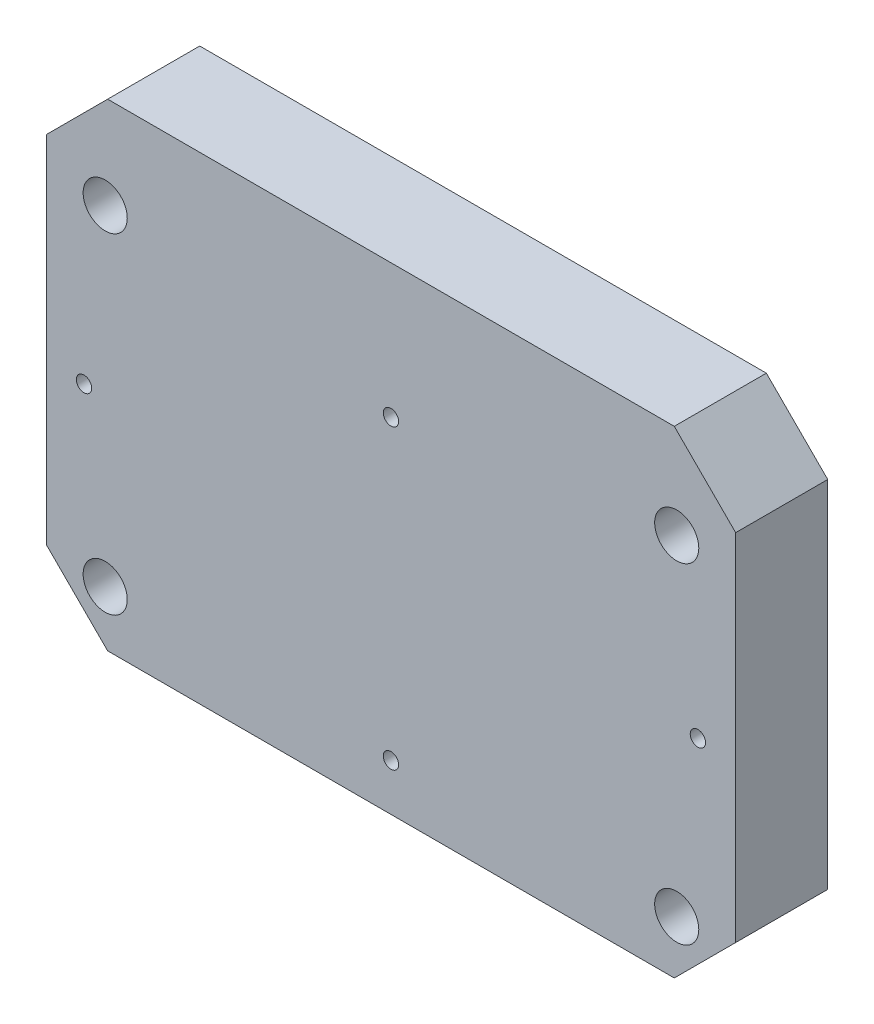
ISO-10303-21;
HEADER;
FILE_DESCRIPTION(('STEP AP214'),'2;1');
FILE_NAME('part.step','',(''),(''),'','','');
FILE_SCHEMA(('AUTOMOTIVE_DESIGN { 1 0 10303 214 1 1 1 1 }'));
ENDSEC;
DATA;
#1=APPLICATION_CONTEXT('core data for automotive mechanical design processes');
#2=APPLICATION_PROTOCOL_DEFINITION('international standard','automotive_design',2000,#1);
#3=PRODUCT_CONTEXT('',#1,'mechanical');
#4=PRODUCT('Part','Part','',(#3));
#5=PRODUCT_RELATED_PRODUCT_CATEGORY('part','',(#4));
#6=PRODUCT_DEFINITION_FORMATION('','',#4);
#7=PRODUCT_DEFINITION_CONTEXT('part definition',#1,'design');
#8=PRODUCT_DEFINITION('design','',#6,#7);
#9=PRODUCT_DEFINITION_SHAPE('','',#8);
#10=(LENGTH_UNIT() NAMED_UNIT(*) SI_UNIT(.MILLI.,.METRE.));
#11=(NAMED_UNIT(*) PLANE_ANGLE_UNIT() SI_UNIT($,.RADIAN.));
#12=(NAMED_UNIT(*) SI_UNIT($,.STERADIAN.) SOLID_ANGLE_UNIT());
#13=UNCERTAINTY_MEASURE_WITH_UNIT(LENGTH_MEASURE(1.E-05),#10,'distance_accuracy_value','');
#14=(GEOMETRIC_REPRESENTATION_CONTEXT(3) GLOBAL_UNCERTAINTY_ASSIGNED_CONTEXT((#13)) GLOBAL_UNIT_ASSIGNED_CONTEXT((#10,
#11,#12)) REPRESENTATION_CONTEXT('',''));
#15=CARTESIAN_POINT('',(0.,0.,0.));
#16=DIRECTION('',(0.,0.,1.));
#17=DIRECTION('',(1.,0.,0.));
#18=AXIS2_PLACEMENT_3D('',#15,#16,#17);
#19=CARTESIAN_POINT('',(71.3144877519594,489.236052622076,19.05));
#20=DIRECTION('',(-1.,0.,0.));
#21=DIRECTION('',(0.,-1.,0.));
#22=AXIS2_PLACEMENT_3D('',#19,#20,#21);
#23=PLANE('',#22);
#24=DIRECTION('',(0.,1.,0.));
#25=VECTOR('',#24,1.);
#26=CARTESIAN_POINT('',(71.3144877519594,489.236052622076,19.05));
#27=LINE('',#26,#25);
#28=CARTESIAN_POINT('',(71.3144877519594,403.092401694058,19.05));
#29=VERTEX_POINT('',#28);
#30=CARTESIAN_POINT('',(71.3144877519594,476.536052622076,19.05));
#31=VERTEX_POINT('',#30);
#32=EDGE_CURVE('E134',#29,#31,#27,.T.);
#33=ORIENTED_EDGE('',*,*,#32,.F.);
#34=DIRECTION('',(0.,0.,-1.));
#35=VECTOR('',#34,1.);
#36=CARTESIAN_POINT('',(71.3144877519594,403.092401694058,19.05));
#37=LINE('',#36,#35);
#38=CARTESIAN_POINT('',(71.3144877519594,403.092401694058,0.));
#39=VERTEX_POINT('',#38);
#40=EDGE_CURVE('E11',#29,#39,#37,.T.);
#41=ORIENTED_EDGE('',*,*,#40,.T.);
#42=DIRECTION('',(0.,1.,0.));
#43=VECTOR('',#42,1.);
#44=CARTESIAN_POINT('',(71.3144877519594,489.236052622076,0.));
#45=LINE('',#44,#43);
#46=CARTESIAN_POINT('',(71.3144877519594,476.536052622076,0.));
#47=VERTEX_POINT('',#46);
#48=EDGE_CURVE('E210',#39,#47,#45,.T.);
#49=ORIENTED_EDGE('',*,*,#48,.T.);
#50=DIRECTION('',(0.,0.,1.));
#51=VECTOR('',#50,1.);
#52=CARTESIAN_POINT('',(71.3144877519594,476.536052622076,19.05));
#53=LINE('',#52,#51);
#54=EDGE_CURVE('E47',#47,#31,#53,.T.);
#55=ORIENTED_EDGE('',*,*,#54,.T.);
#56=EDGE_LOOP('',(#33,#41,#49,#55));
#57=FACE_BOUND('',#56,.T.);
#58=ADVANCED_FACE('F37',(#57),#23,.F.);
#59=CARTESIAN_POINT('',(71.3144877519594,489.236052622076,19.05));
#60=DIRECTION('',(0.,-1.,0.));
#61=DIRECTION('',(0.,0.,-1.));
#62=AXIS2_PLACEMENT_3D('',#59,#60,#61);
#63=PLANE('',#62);
#64=DIRECTION('',(-1.,0.,0.));
#65=VECTOR('',#64,1.);
#66=CARTESIAN_POINT('',(71.3144877519594,489.236052622076,0.));
#67=LINE('',#66,#65);
#68=CARTESIAN_POINT('',(58.6144877519594,489.236052622076,0.));
#69=VERTEX_POINT('',#68);
#70=CARTESIAN_POINT('',(-58.6144877521835,489.236052622076,0.));
#71=VERTEX_POINT('',#70);
#72=EDGE_CURVE('E139',#69,#71,#67,.T.);
#73=ORIENTED_EDGE('',*,*,#72,.T.);
#74=DIRECTION('',(0.,0.,1.));
#75=VECTOR('',#74,1.);
#76=CARTESIAN_POINT('',(-58.6144877521835,489.236052622076,19.05));
#77=LINE('',#76,#75);
#78=CARTESIAN_POINT('',(-58.6144877521835,489.236052622076,19.05));
#79=VERTEX_POINT('',#78);
#80=EDGE_CURVE('E55',#71,#79,#77,.T.);
#81=ORIENTED_EDGE('',*,*,#80,.T.);
#82=DIRECTION('',(-1.,0.,0.));
#83=VECTOR('',#82,1.);
#84=CARTESIAN_POINT('',(71.3144877519594,489.236052622076,19.05));
#85=LINE('',#84,#83);
#86=CARTESIAN_POINT('',(58.6144877519594,489.236052622076,19.05));
#87=VERTEX_POINT('',#86);
#88=EDGE_CURVE('E137',#87,#79,#85,.T.);
#89=ORIENTED_EDGE('',*,*,#88,.F.);
#90=DIRECTION('',(0.,0.,-1.));
#91=VECTOR('',#90,1.);
#92=CARTESIAN_POINT('',(58.6144877519594,489.236052622076,19.05));
#93=LINE('',#92,#91);
#94=EDGE_CURVE('E157',#87,#69,#93,.T.);
#95=ORIENTED_EDGE('',*,*,#94,.T.);
#96=EDGE_LOOP('',(#73,#81,#89,#95));
#97=FACE_BOUND('',#96,.T.);
#98=ADVANCED_FACE('F219',(#97),#63,.F.);
#99=CARTESIAN_POINT('',(-71.3144877521836,489.236052622076,19.05));
#100=DIRECTION('',(1.,0.,0.));
#101=DIRECTION('',(0.,0.,-1.));
#102=AXIS2_PLACEMENT_3D('',#99,#100,#101);
#103=PLANE('',#102);
#104=DIRECTION('',(0.,-1.,0.));
#105=VECTOR('',#104,1.);
#106=CARTESIAN_POINT('',(-71.3144877521836,489.236052622076,0.));
#107=LINE('',#106,#105);
#108=CARTESIAN_POINT('',(-71.3144877521836,476.536052622076,0.));
#109=VERTEX_POINT('',#108);
#110=CARTESIAN_POINT('',(-71.3144877521836,403.092401694058,0.));
#111=VERTEX_POINT('',#110);
#112=EDGE_CURVE('E135',#109,#111,#107,.T.);
#113=ORIENTED_EDGE('',*,*,#112,.T.);
#114=DIRECTION('',(0.,0.,1.));
#115=VECTOR('',#114,1.);
#116=CARTESIAN_POINT('',(-71.3144877521836,403.092401694058,19.05));
#117=LINE('',#116,#115);
#118=CARTESIAN_POINT('',(-71.3144877521836,403.092401694058,19.05));
#119=VERTEX_POINT('',#118);
#120=EDGE_CURVE('E112',#111,#119,#117,.T.);
#121=ORIENTED_EDGE('',*,*,#120,.T.);
#122=DIRECTION('',(0.,-1.,0.));
#123=VECTOR('',#122,1.);
#124=CARTESIAN_POINT('',(-71.3144877521836,489.236052622076,19.05));
#125=LINE('',#124,#123);
#126=CARTESIAN_POINT('',(-71.3144877521836,476.536052622076,19.05));
#127=VERTEX_POINT('',#126);
#128=EDGE_CURVE('E213',#127,#119,#125,.T.);
#129=ORIENTED_EDGE('',*,*,#128,.F.);
#130=DIRECTION('',(0.,0.,-1.));
#131=VECTOR('',#130,1.);
#132=CARTESIAN_POINT('',(-71.3144877521836,476.536052622076,19.05));
#133=LINE('',#132,#131);
#134=EDGE_CURVE('E117',#127,#109,#133,.T.);
#135=ORIENTED_EDGE('',*,*,#134,.T.);
#136=EDGE_LOOP('',(#113,#121,#129,#135));
#137=FACE_BOUND('',#136,.T.);
#138=ADVANCED_FACE('F228',(#137),#103,.F.);
#139=CARTESIAN_POINT('',(71.3144877519594,390.392401694058,19.05));
#140=DIRECTION('',(0.,1.,0.));
#141=DIRECTION('',(0.,0.,1.));
#142=AXIS2_PLACEMENT_3D('',#139,#140,#141);
#143=PLANE('',#142);
#144=DIRECTION('',(1.,0.,0.));
#145=VECTOR('',#144,1.);
#146=CARTESIAN_POINT('',(71.3144877519594,390.392401694058,19.05));
#147=LINE('',#146,#145);
#148=CARTESIAN_POINT('',(-58.6144877521835,390.392401694058,19.05));
#149=VERTEX_POINT('',#148);
#150=CARTESIAN_POINT('',(58.6144877519594,390.392401694058,19.05));
#151=VERTEX_POINT('',#150);
#152=EDGE_CURVE('E127',#149,#151,#147,.T.);
#153=ORIENTED_EDGE('',*,*,#152,.F.);
#154=DIRECTION('',(0.,0.,-1.));
#155=VECTOR('',#154,1.);
#156=CARTESIAN_POINT('',(-58.6144877521835,390.392401694058,19.05));
#157=LINE('',#156,#155);
#158=CARTESIAN_POINT('',(-58.6144877521835,390.392401694058,0.));
#159=VERTEX_POINT('',#158);
#160=EDGE_CURVE('E111',#149,#159,#157,.T.);
#161=ORIENTED_EDGE('',*,*,#160,.T.);
#162=DIRECTION('',(1.,0.,0.));
#163=VECTOR('',#162,1.);
#164=CARTESIAN_POINT('',(71.3144877519594,390.392401694058,0.));
#165=LINE('',#164,#163);
#166=CARTESIAN_POINT('',(58.6144877519594,390.392401694058,0.));
#167=VERTEX_POINT('',#166);
#168=EDGE_CURVE('E124',#159,#167,#165,.T.);
#169=ORIENTED_EDGE('',*,*,#168,.T.);
#170=DIRECTION('',(0.,0.,1.));
#171=VECTOR('',#170,1.);
#172=CARTESIAN_POINT('',(58.6144877519594,390.392401694058,19.05));
#173=LINE('',#172,#171);
#174=EDGE_CURVE('E129',#167,#151,#173,.T.);
#175=ORIENTED_EDGE('',*,*,#174,.T.);
#176=EDGE_LOOP('',(#153,#161,#169,#175));
#177=FACE_BOUND('',#176,.T.);
#178=ADVANCED_FACE('F123',(#177),#143,.F.);
#179=CARTESIAN_POINT('',(0.,0.,19.05));
#180=DIRECTION('',(0.,0.,-1.));
#181=DIRECTION('',(-1.,0.,0.));
#182=AXIS2_PLACEMENT_3D('',#179,#180,#181);
#183=PLANE('',#182);
#184=CARTESIAN_POINT('',(63.500000000001,435.779526687774,19.05));
#185=DIRECTION('',(0.,0.,-1.));
#186=DIRECTION('',(-1.,0.,0.));
#187=AXIS2_PLACEMENT_3D('',#184,#185,#186);
#188=CIRCLE('',#187,1.58750000000001);
#189=CARTESIAN_POINT('',(61.912500000001,435.779526687774,19.05));
#190=VERTEX_POINT('',#189);
#191=EDGE_CURVE('E42',#190,#190,#188,.T.);
#192=ORIENTED_EDGE('',*,*,#191,.T.);
#193=EDGE_LOOP('',(#192));
#194=FACE_BOUND('',#193,.T.);
#195=CARTESIAN_POINT('',(0.,461.558384256229,19.05));
#196=DIRECTION('',(0.,0.,-1.));
#197=DIRECTION('',(-1.,0.,0.));
#198=AXIS2_PLACEMENT_3D('',#195,#196,#197);
#199=CIRCLE('',#198,1.58750000000001);
#200=CARTESIAN_POINT('',(-1.58750000000001,461.558384256229,19.05));
#201=VERTEX_POINT('',#200);
#202=EDGE_CURVE('E169',#201,#201,#199,.T.);
#203=ORIENTED_EDGE('',*,*,#202,.T.);
#204=EDGE_LOOP('',(#203));
#205=FACE_BOUND('',#204,.T.);
#206=CARTESIAN_POINT('',(0.,400.075074406295,19.05));
#207=DIRECTION('',(0.,0.,-1.));
#208=DIRECTION('',(-1.,0.,0.));
#209=AXIS2_PLACEMENT_3D('',#206,#207,#208);
#210=CIRCLE('',#209,1.58750000000001);
#211=CARTESIAN_POINT('',(-1.58750000000001,400.075074406295,19.05));
#212=VERTEX_POINT('',#211);
#213=EDGE_CURVE('E167',#212,#212,#210,.T.);
#214=ORIENTED_EDGE('',*,*,#213,.T.);
#215=EDGE_LOOP('',(#214));
#216=FACE_BOUND('',#215,.T.);
#217=CARTESIAN_POINT('',(-63.500000000001,435.779526687774,19.05));
#218=DIRECTION('',(0.,0.,-1.));
#219=DIRECTION('',(-1.,0.,0.));
#220=AXIS2_PLACEMENT_3D('',#217,#218,#219);
#221=CIRCLE('',#220,1.58750000000001);
#222=CARTESIAN_POINT('',(-65.087500000001,435.779526687774,19.05));
#223=VERTEX_POINT('',#222);
#224=EDGE_CURVE('E165',#223,#223,#221,.T.);
#225=ORIENTED_EDGE('',*,*,#224,.T.);
#226=EDGE_LOOP('',(#225));
#227=FACE_BOUND('',#226,.T.);
#228=CARTESIAN_POINT('',(-59.1200000000001,469.942526687767,19.05));
#229=DIRECTION('',(0.,0.,1.));
#230=DIRECTION('',(1.,0.,0.));
#231=AXIS2_PLACEMENT_3D('',#228,#229,#230);
#232=CIRCLE('',#231,4.56412599999999);
#233=CARTESIAN_POINT('',(-54.5558740000001,469.942526687767,19.05));
#234=VERTEX_POINT('',#233);
#235=EDGE_CURVE('E187',#234,#234,#232,.T.);
#236=ORIENTED_EDGE('',*,*,#235,.F.);
#237=EDGE_LOOP('',(#236));
#238=FACE_BOUND('',#237,.T.);
#239=CARTESIAN_POINT('',(59.1199999999999,469.942526687767,19.05));
#240=DIRECTION('',(0.,0.,1.));
#241=DIRECTION('',(1.,0.,0.));
#242=AXIS2_PLACEMENT_3D('',#239,#240,#241);
#243=CIRCLE('',#242,4.56412599999999);
#244=CARTESIAN_POINT('',(63.6841259999999,469.942526687767,19.05));
#245=VERTEX_POINT('',#244);
#246=EDGE_CURVE('E193',#245,#245,#243,.T.);
#247=ORIENTED_EDGE('',*,*,#246,.F.);
#248=EDGE_LOOP('',(#247));
#249=FACE_BOUND('',#248,.T.);
#250=CARTESIAN_POINT('',(59.1199999999999,401.616526687767,19.05));
#251=DIRECTION('',(0.,0.,1.));
#252=DIRECTION('',(1.,0.,0.));
#253=AXIS2_PLACEMENT_3D('',#250,#251,#252);
#254=CIRCLE('',#253,4.56412599999999);
#255=CARTESIAN_POINT('',(63.6841259999999,401.616526687767,19.05));
#256=VERTEX_POINT('',#255);
#257=EDGE_CURVE('E199',#256,#256,#254,.T.);
#258=ORIENTED_EDGE('',*,*,#257,.F.);
#259=EDGE_LOOP('',(#258));
#260=FACE_BOUND('',#259,.T.);
#261=CARTESIAN_POINT('',(-59.1200000000001,401.616526687767,19.05));
#262=DIRECTION('',(0.,0.,1.));
#263=DIRECTION('',(1.,0.,0.));
#264=AXIS2_PLACEMENT_3D('',#261,#262,#263);
#265=CIRCLE('',#264,4.56412599999999);
#266=CARTESIAN_POINT('',(-54.5558740000001,401.616526687767,19.05));
#267=VERTEX_POINT('',#266);
#268=EDGE_CURVE('E205',#267,#267,#265,.T.);
#269=ORIENTED_EDGE('',*,*,#268,.F.);
#270=EDGE_LOOP('',(#269));
#271=FACE_BOUND('',#270,.T.);
#272=ORIENTED_EDGE('',*,*,#128,.T.);
#273=DIRECTION('',(-0.707106781186549,0.707106781186546,0.));
#274=VECTOR('',#273,1.);
#275=CARTESIAN_POINT('',(-58.6144877521835,390.392401694058,19.05));
#276=LINE('',#275,#274);
#277=EDGE_CURVE('E155',#119,#149,#276,.F.);
#278=ORIENTED_EDGE('',*,*,#277,.T.);
#279=ORIENTED_EDGE('',*,*,#152,.T.);
#280=DIRECTION('',(-0.707106781186549,-0.707106781186546,0.));
#281=VECTOR('',#280,1.);
#282=CARTESIAN_POINT('',(71.3144877519594,403.092401694058,19.05));
#283=LINE('',#282,#281);
#284=EDGE_CURVE('E151',#151,#29,#283,.F.);
#285=ORIENTED_EDGE('',*,*,#284,.T.);
#286=ORIENTED_EDGE('',*,*,#32,.T.);
#287=DIRECTION('',(0.707106781186546,-0.707106781186549,0.));
#288=VECTOR('',#287,1.);
#289=CARTESIAN_POINT('',(58.6144877519594,489.236052622076,19.05));
#290=LINE('',#289,#288);
#291=EDGE_CURVE('E62',#31,#87,#290,.F.);
#292=ORIENTED_EDGE('',*,*,#291,.T.);
#293=ORIENTED_EDGE('',*,*,#88,.T.);
#294=DIRECTION('',(0.70710678118655,0.707106781186545,0.));
#295=VECTOR('',#294,1.);
#296=CARTESIAN_POINT('',(-71.3144877521836,476.536052622076,19.05));
#297=LINE('',#296,#295);
#298=EDGE_CURVE('E153',#79,#127,#297,.F.);
#299=ORIENTED_EDGE('',*,*,#298,.T.);
#300=EDGE_LOOP('',(#272,#278,#279,#285,#286,#292,#293,#299));
#301=FACE_BOUND('',#300,.T.);
#302=ADVANCED_FACE('F226',(#194,#205,#216,#227,#238,#249,#260,#271,#301),#183,.F.);
#303=CARTESIAN_POINT('',(0.,0.,0.));
#304=DIRECTION('',(0.,0.,-1.));
#305=DIRECTION('',(-1.,0.,0.));
#306=AXIS2_PLACEMENT_3D('',#303,#304,#305);
#307=PLANE('',#306);
#308=CARTESIAN_POINT('',(63.500000000001,435.779526687774,0.));
#309=DIRECTION('',(0.,0.,-1.));
#310=DIRECTION('',(-1.,0.,0.));
#311=AXIS2_PLACEMENT_3D('',#308,#309,#310);
#312=CIRCLE('',#311,1.58750000000001);
#313=CARTESIAN_POINT('',(61.912500000001,435.779526687774,0.));
#314=VERTEX_POINT('',#313);
#315=EDGE_CURVE('E172',#314,#314,#312,.T.);
#316=ORIENTED_EDGE('',*,*,#315,.F.);
#317=EDGE_LOOP('',(#316));
#318=FACE_BOUND('',#317,.T.);
#319=CARTESIAN_POINT('',(0.,461.558384256229,0.));
#320=DIRECTION('',(0.,0.,-1.));
#321=DIRECTION('',(-1.,0.,0.));
#322=AXIS2_PLACEMENT_3D('',#319,#320,#321);
#323=CIRCLE('',#322,1.58750000000001);
#324=CARTESIAN_POINT('',(-1.58750000000001,461.558384256229,0.));
#325=VERTEX_POINT('',#324);
#326=EDGE_CURVE('E170',#325,#325,#323,.T.);
#327=ORIENTED_EDGE('',*,*,#326,.F.);
#328=EDGE_LOOP('',(#327));
#329=FACE_BOUND('',#328,.T.);
#330=CARTESIAN_POINT('',(0.,400.075074406295,0.));
#331=DIRECTION('',(0.,0.,-1.));
#332=DIRECTION('',(-1.,0.,0.));
#333=AXIS2_PLACEMENT_3D('',#330,#331,#332);
#334=CIRCLE('',#333,1.58750000000001);
#335=CARTESIAN_POINT('',(-1.58750000000001,400.075074406295,0.));
#336=VERTEX_POINT('',#335);
#337=EDGE_CURVE('E166',#336,#336,#334,.T.);
#338=ORIENTED_EDGE('',*,*,#337,.F.);
#339=EDGE_LOOP('',(#338));
#340=FACE_BOUND('',#339,.T.);
#341=CARTESIAN_POINT('',(-63.500000000001,435.779526687774,0.));
#342=DIRECTION('',(0.,0.,-1.));
#343=DIRECTION('',(-1.,0.,0.));
#344=AXIS2_PLACEMENT_3D('',#341,#342,#343);
#345=CIRCLE('',#344,1.58750000000001);
#346=CARTESIAN_POINT('',(-65.087500000001,435.779526687774,0.));
#347=VERTEX_POINT('',#346);
#348=EDGE_CURVE('E162',#347,#347,#345,.T.);
#349=ORIENTED_EDGE('',*,*,#348,.F.);
#350=EDGE_LOOP('',(#349));
#351=FACE_BOUND('',#350,.T.);
#352=CARTESIAN_POINT('',(-59.1200000000001,469.942526687767,0.));
#353=DIRECTION('',(0.,0.,1.));
#354=DIRECTION('',(1.,0.,0.));
#355=AXIS2_PLACEMENT_3D('',#352,#353,#354);
#356=CIRCLE('',#355,4.56412599999999);
#357=CARTESIAN_POINT('',(-54.5558740000001,469.942526687767,0.));
#358=VERTEX_POINT('',#357);
#359=EDGE_CURVE('E190',#358,#358,#356,.T.);
#360=ORIENTED_EDGE('',*,*,#359,.T.);
#361=EDGE_LOOP('',(#360));
#362=FACE_BOUND('',#361,.T.);
#363=CARTESIAN_POINT('',(59.1199999999999,469.942526687767,0.));
#364=DIRECTION('',(0.,0.,1.));
#365=DIRECTION('',(1.,0.,0.));
#366=AXIS2_PLACEMENT_3D('',#363,#364,#365);
#367=CIRCLE('',#366,4.564126);
#368=CARTESIAN_POINT('',(63.6841259999999,469.942526687767,0.));
#369=VERTEX_POINT('',#368);
#370=EDGE_CURVE('E196',#369,#369,#367,.T.);
#371=ORIENTED_EDGE('',*,*,#370,.T.);
#372=EDGE_LOOP('',(#371));
#373=FACE_BOUND('',#372,.T.);
#374=CARTESIAN_POINT('',(59.1199999999999,401.616526687767,0.));
#375=DIRECTION('',(0.,0.,1.));
#376=DIRECTION('',(1.,0.,0.));
#377=AXIS2_PLACEMENT_3D('',#374,#375,#376);
#378=CIRCLE('',#377,4.564126);
#379=CARTESIAN_POINT('',(63.6841259999999,401.616526687767,0.));
#380=VERTEX_POINT('',#379);
#381=EDGE_CURVE('E202',#380,#380,#378,.T.);
#382=ORIENTED_EDGE('',*,*,#381,.T.);
#383=EDGE_LOOP('',(#382));
#384=FACE_BOUND('',#383,.T.);
#385=CARTESIAN_POINT('',(-59.1200000000001,401.616526687767,0.));
#386=DIRECTION('',(0.,0.,1.));
#387=DIRECTION('',(1.,0.,0.));
#388=AXIS2_PLACEMENT_3D('',#385,#386,#387);
#389=CIRCLE('',#388,4.56412599999999);
#390=CARTESIAN_POINT('',(-54.5558740000001,401.616526687767,0.));
#391=VERTEX_POINT('',#390);
#392=EDGE_CURVE('E208',#391,#391,#389,.T.);
#393=ORIENTED_EDGE('',*,*,#392,.T.);
#394=EDGE_LOOP('',(#393));
#395=FACE_BOUND('',#394,.T.);
#396=ORIENTED_EDGE('',*,*,#168,.F.);
#397=DIRECTION('',(0.707106781186549,-0.707106781186546,0.));
#398=VECTOR('',#397,1.);
#399=CARTESIAN_POINT('',(165.888956970937,165.888956970938,0.));
#400=LINE('',#399,#398);
#401=EDGE_CURVE('E107',#159,#111,#400,.F.);
#402=ORIENTED_EDGE('',*,*,#401,.T.);
#403=ORIENTED_EDGE('',*,*,#112,.F.);
#404=DIRECTION('',(-0.70710678118655,-0.707106781186545,0.));
#405=VECTOR('',#404,1.);
#406=CARTESIAN_POINT('',(-273.925270187129,273.925270187131,0.));
#407=LINE('',#406,#405);
#408=EDGE_CURVE('E118',#109,#71,#407,.F.);
#409=ORIENTED_EDGE('',*,*,#408,.T.);
#410=ORIENTED_EDGE('',*,*,#72,.F.);
#411=DIRECTION('',(-0.707106781186546,0.707106781186549,0.));
#412=VECTOR('',#411,1.);
#413=CARTESIAN_POINT('',(273.925270187018,273.925270187017,0.));
#414=LINE('',#413,#412);
#415=EDGE_CURVE('E128',#69,#47,#414,.F.);
#416=ORIENTED_EDGE('',*,*,#415,.T.);
#417=ORIENTED_EDGE('',*,*,#48,.F.);
#418=DIRECTION('',(0.707106781186549,0.707106781186546,0.));
#419=VECTOR('',#418,1.);
#420=CARTESIAN_POINT('',(-165.888956971049,165.88895697105,0.));
#421=LINE('',#420,#419);
#422=EDGE_CURVE('E133',#39,#167,#421,.F.);
#423=ORIENTED_EDGE('',*,*,#422,.T.);
#424=EDGE_LOOP('',(#396,#402,#403,#409,#410,#416,#417,#423));
#425=FACE_BOUND('',#424,.T.);
#426=ADVANCED_FACE('F131',(#318,#329,#340,#351,#362,#373,#384,#395,#425),#307,.T.);
#427=CARTESIAN_POINT('',(-58.6144877521835,390.392401694058,19.05));
#428=DIRECTION('',(0.707106781186546,0.707106781186549,0.));
#429=DIRECTION('',(0.,0.,-1.));
#430=AXIS2_PLACEMENT_3D('',#427,#428,#429);
#431=PLANE('',#430);
#432=ORIENTED_EDGE('',*,*,#277,.F.);
#433=ORIENTED_EDGE('',*,*,#120,.F.);
#434=ORIENTED_EDGE('',*,*,#401,.F.);
#435=ORIENTED_EDGE('',*,*,#160,.F.);
#436=EDGE_LOOP('',(#432,#433,#434,#435));
#437=FACE_BOUND('',#436,.T.);
#438=ADVANCED_FACE('F110',(#437),#431,.F.);
#439=CARTESIAN_POINT('',(-71.3144877521836,476.536052622076,19.05));
#440=DIRECTION('',(0.707106781186545,-0.70710678118655,0.));
#441=DIRECTION('',(0.,0.,-1.));
#442=AXIS2_PLACEMENT_3D('',#439,#440,#441);
#443=PLANE('',#442);
#444=ORIENTED_EDGE('',*,*,#298,.F.);
#445=ORIENTED_EDGE('',*,*,#80,.F.);
#446=ORIENTED_EDGE('',*,*,#408,.F.);
#447=ORIENTED_EDGE('',*,*,#134,.F.);
#448=EDGE_LOOP('',(#444,#445,#446,#447));
#449=FACE_BOUND('',#448,.T.);
#450=ADVANCED_FACE('F223',(#449),#443,.F.);
#451=CARTESIAN_POINT('',(71.3144877519594,403.092401694058,19.05));
#452=DIRECTION('',(-0.707106781186546,0.707106781186549,0.));
#453=DIRECTION('',(0.,0.,-1.));
#454=AXIS2_PLACEMENT_3D('',#451,#452,#453);
#455=PLANE('',#454);
#456=ORIENTED_EDGE('',*,*,#284,.F.);
#457=ORIENTED_EDGE('',*,*,#174,.F.);
#458=ORIENTED_EDGE('',*,*,#422,.F.);
#459=ORIENTED_EDGE('',*,*,#40,.F.);
#460=EDGE_LOOP('',(#456,#457,#458,#459));
#461=FACE_BOUND('',#460,.T.);
#462=ADVANCED_FACE('F254',(#461),#455,.F.);
#463=CARTESIAN_POINT('',(58.6144877519594,489.236052622076,19.05));
#464=DIRECTION('',(-0.707106781186549,-0.707106781186546,0.));
#465=DIRECTION('',(0.,0.,-1.));
#466=AXIS2_PLACEMENT_3D('',#463,#464,#465);
#467=PLANE('',#466);
#468=ORIENTED_EDGE('',*,*,#291,.F.);
#469=ORIENTED_EDGE('',*,*,#54,.F.);
#470=ORIENTED_EDGE('',*,*,#415,.F.);
#471=ORIENTED_EDGE('',*,*,#94,.F.);
#472=EDGE_LOOP('',(#468,#469,#470,#471));
#473=FACE_BOUND('',#472,.T.);
#474=ADVANCED_FACE('F40',(#473),#467,.F.);
#475=CARTESIAN_POINT('',(-59.1200000000001,401.616526687767,19.05));
#476=DIRECTION('',(0.,0.,1.));
#477=DIRECTION('',(1.,0.,0.));
#478=AXIS2_PLACEMENT_3D('',#475,#476,#477);
#479=CYLINDRICAL_SURFACE('',#478,4.56412599999999);
#480=ORIENTED_EDGE('',*,*,#392,.F.);
#481=EDGE_LOOP('',(#480));
#482=FACE_BOUND('',#481,.T.);
#483=ORIENTED_EDGE('',*,*,#268,.T.);
#484=EDGE_LOOP('',(#483));
#485=FACE_BOUND('',#484,.T.);
#486=ADVANCED_FACE('F262',(#482,#485),#479,.F.);
#487=CARTESIAN_POINT('',(59.1199999999999,401.616526687767,19.05));
#488=DIRECTION('',(0.,0.,1.));
#489=DIRECTION('',(1.,0.,0.));
#490=AXIS2_PLACEMENT_3D('',#487,#488,#489);
#491=CYLINDRICAL_SURFACE('',#490,4.56412599999999);
#492=ORIENTED_EDGE('',*,*,#381,.F.);
#493=EDGE_LOOP('',(#492));
#494=FACE_BOUND('',#493,.T.);
#495=ORIENTED_EDGE('',*,*,#257,.T.);
#496=EDGE_LOOP('',(#495));
#497=FACE_BOUND('',#496,.T.);
#498=ADVANCED_FACE('F270',(#494,#497),#491,.F.);
#499=CARTESIAN_POINT('',(59.1199999999999,469.942526687767,19.05));
#500=DIRECTION('',(0.,0.,1.));
#501=DIRECTION('',(1.,0.,0.));
#502=AXIS2_PLACEMENT_3D('',#499,#500,#501);
#503=CYLINDRICAL_SURFACE('',#502,4.56412599999999);
#504=ORIENTED_EDGE('',*,*,#370,.F.);
#505=EDGE_LOOP('',(#504));
#506=FACE_BOUND('',#505,.T.);
#507=ORIENTED_EDGE('',*,*,#246,.T.);
#508=EDGE_LOOP('',(#507));
#509=FACE_BOUND('',#508,.T.);
#510=ADVANCED_FACE('F276',(#506,#509),#503,.F.);
#511=CARTESIAN_POINT('',(-59.1200000000001,469.942526687767,19.05));
#512=DIRECTION('',(0.,0.,1.));
#513=DIRECTION('',(1.,0.,0.));
#514=AXIS2_PLACEMENT_3D('',#511,#512,#513);
#515=CYLINDRICAL_SURFACE('',#514,4.56412599999999);
#516=ORIENTED_EDGE('',*,*,#359,.F.);
#517=EDGE_LOOP('',(#516));
#518=FACE_BOUND('',#517,.T.);
#519=ORIENTED_EDGE('',*,*,#235,.T.);
#520=EDGE_LOOP('',(#519));
#521=FACE_BOUND('',#520,.T.);
#522=ADVANCED_FACE('F310',(#518,#521),#515,.F.);
#523=CARTESIAN_POINT('',(-63.500000000001,435.779526687774,-19.0500000001226));
#524=DIRECTION('',(0.,0.,-1.));
#525=DIRECTION('',(-1.,0.,0.));
#526=AXIS2_PLACEMENT_3D('',#523,#524,#525);
#527=CYLINDRICAL_SURFACE('',#526,1.58750000000001);
#528=ORIENTED_EDGE('',*,*,#348,.T.);
#529=EDGE_LOOP('',(#528));
#530=FACE_BOUND('',#529,.T.);
#531=ORIENTED_EDGE('',*,*,#224,.F.);
#532=EDGE_LOOP('',(#531));
#533=FACE_BOUND('',#532,.T.);
#534=ADVANCED_FACE('F316',(#530,#533),#527,.F.);
#535=CARTESIAN_POINT('',(0.,400.075074406295,-19.0500000001226));
#536=DIRECTION('',(0.,0.,-1.));
#537=DIRECTION('',(-1.,0.,0.));
#538=AXIS2_PLACEMENT_3D('',#535,#536,#537);
#539=CYLINDRICAL_SURFACE('',#538,1.58750000000001);
#540=ORIENTED_EDGE('',*,*,#337,.T.);
#541=EDGE_LOOP('',(#540));
#542=FACE_BOUND('',#541,.T.);
#543=ORIENTED_EDGE('',*,*,#213,.F.);
#544=EDGE_LOOP('',(#543));
#545=FACE_BOUND('',#544,.T.);
#546=ADVANCED_FACE('F322',(#542,#545),#539,.F.);
#547=CARTESIAN_POINT('',(0.,461.558384256229,-19.0500000001226));
#548=DIRECTION('',(0.,0.,-1.));
#549=DIRECTION('',(-1.,0.,0.));
#550=AXIS2_PLACEMENT_3D('',#547,#548,#549);
#551=CYLINDRICAL_SURFACE('',#550,1.58750000000001);
#552=ORIENTED_EDGE('',*,*,#326,.T.);
#553=EDGE_LOOP('',(#552));
#554=FACE_BOUND('',#553,.T.);
#555=ORIENTED_EDGE('',*,*,#202,.F.);
#556=EDGE_LOOP('',(#555));
#557=FACE_BOUND('',#556,.T.);
#558=ADVANCED_FACE('F326',(#554,#557),#551,.F.);
#559=CARTESIAN_POINT('',(63.500000000001,435.779526687774,-19.0500000001226));
#560=DIRECTION('',(0.,0.,-1.));
#561=DIRECTION('',(-1.,0.,0.));
#562=AXIS2_PLACEMENT_3D('',#559,#560,#561);
#563=CYLINDRICAL_SURFACE('',#562,1.58750000000001);
#564=ORIENTED_EDGE('',*,*,#315,.T.);
#565=EDGE_LOOP('',(#564));
#566=FACE_BOUND('',#565,.T.);
#567=ORIENTED_EDGE('',*,*,#191,.F.);
#568=EDGE_LOOP('',(#567));
#569=FACE_BOUND('',#568,.T.);
#570=ADVANCED_FACE('F330',(#566,#569),#563,.F.);
#571=CLOSED_SHELL('',(#58,#98,#138,#178,#302,#426,#438,#450,#462,#474,#486,#498,#510,#522,#534,
#546,#558,#570));
#572=MANIFOLD_SOLID_BREP('B2',#571);
#573=ADVANCED_BREP_SHAPE_REPRESENTATION('',(#18,#572),#14);
#574=SHAPE_DEFINITION_REPRESENTATION(#9,#573);
ENDSEC;
END-ISO-10303-21;
